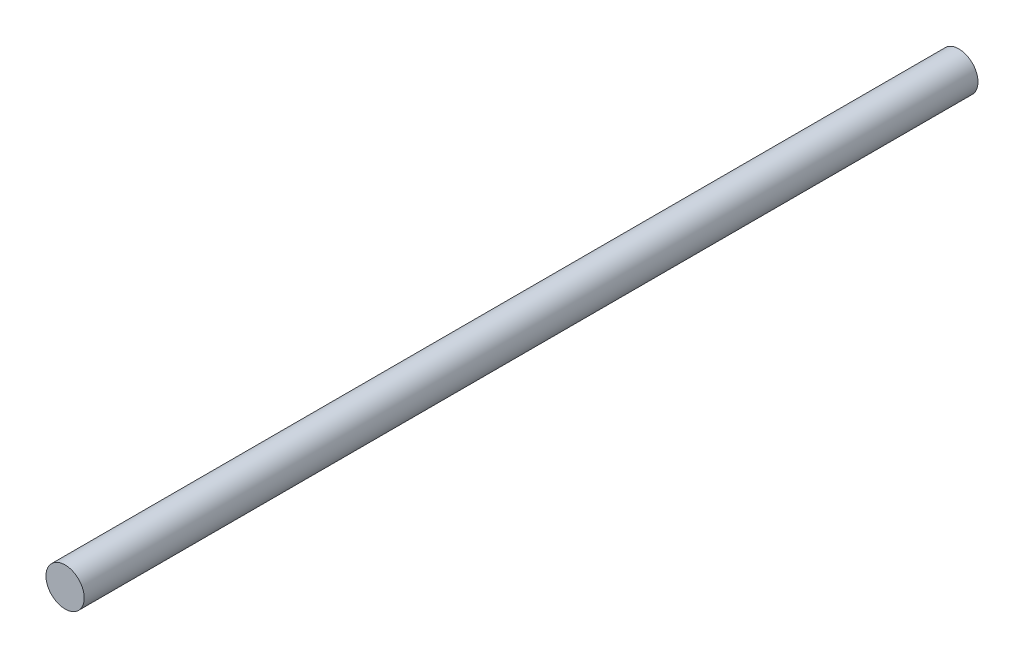
ISO-10303-21;
HEADER;
FILE_DESCRIPTION(('STEP AP214'),'2;1');
FILE_NAME('part.step','',(''),(''),'','','');
FILE_SCHEMA(('AUTOMOTIVE_DESIGN { 1 0 10303 214 1 1 1 1 }'));
ENDSEC;
DATA;
#1=APPLICATION_CONTEXT('core data for automotive mechanical design processes');
#2=APPLICATION_PROTOCOL_DEFINITION('international standard','automotive_design',2000,#1);
#3=PRODUCT_CONTEXT('',#1,'mechanical');
#4=PRODUCT('Part','Part','',(#3));
#5=PRODUCT_RELATED_PRODUCT_CATEGORY('part','',(#4));
#6=PRODUCT_DEFINITION_FORMATION('','',#4);
#7=PRODUCT_DEFINITION_CONTEXT('part definition',#1,'design');
#8=PRODUCT_DEFINITION('design','',#6,#7);
#9=PRODUCT_DEFINITION_SHAPE('','',#8);
#10=(LENGTH_UNIT() NAMED_UNIT(*) SI_UNIT(.MILLI.,.METRE.));
#11=(NAMED_UNIT(*) PLANE_ANGLE_UNIT() SI_UNIT($,.RADIAN.));
#12=(NAMED_UNIT(*) SI_UNIT($,.STERADIAN.) SOLID_ANGLE_UNIT());
#13=UNCERTAINTY_MEASURE_WITH_UNIT(LENGTH_MEASURE(1.E-05),#10,'distance_accuracy_value','');
#14=(GEOMETRIC_REPRESENTATION_CONTEXT(3) GLOBAL_UNCERTAINTY_ASSIGNED_CONTEXT((#13)) GLOBAL_UNIT_ASSIGNED_CONTEXT((#10,
#11,#12)) REPRESENTATION_CONTEXT('',''));
#15=CARTESIAN_POINT('',(0.,0.,0.));
#16=DIRECTION('',(0.,0.,1.));
#17=DIRECTION('',(1.,0.,0.));
#18=AXIS2_PLACEMENT_3D('',#15,#16,#17);
#19=CARTESIAN_POINT('',(0.,0.,500.));
#20=DIRECTION('',(0.,0.,-1.));
#21=DIRECTION('',(-1.,0.,0.));
#22=AXIS2_PLACEMENT_3D('',#19,#20,#21);
#23=CYLINDRICAL_SURFACE('',#22,10.7);
#24=CARTESIAN_POINT('',(0.,0.,500.));
#25=DIRECTION('',(0.,0.,1.));
#26=DIRECTION('',(1.,0.,0.));
#27=AXIS2_PLACEMENT_3D('',#24,#25,#26);
#28=CIRCLE('',#27,10.7);
#29=CARTESIAN_POINT('',(10.7,0.,500.));
#30=VERTEX_POINT('',#29);
#31=EDGE_CURVE('E10',#30,#30,#28,.T.);
#32=ORIENTED_EDGE('',*,*,#31,.F.);
#33=EDGE_LOOP('',(#32));
#34=FACE_BOUND('',#33,.T.);
#35=CARTESIAN_POINT('',(0.,0.,0.));
#36=DIRECTION('',(0.,0.,1.));
#37=DIRECTION('',(1.,0.,0.));
#38=AXIS2_PLACEMENT_3D('',#35,#36,#37);
#39=CIRCLE('',#38,10.7);
#40=CARTESIAN_POINT('',(10.7,0.,0.));
#41=VERTEX_POINT('',#40);
#42=EDGE_CURVE('E40',#41,#41,#39,.T.);
#43=ORIENTED_EDGE('',*,*,#42,.T.);
#44=EDGE_LOOP('',(#43));
#45=FACE_BOUND('',#44,.T.);
#46=ADVANCED_FACE('F37',(#34,#45),#23,.T.);
#47=CARTESIAN_POINT('',(0.,0.,500.));
#48=DIRECTION('',(0.,0.,1.));
#49=DIRECTION('',(1.,0.,0.));
#50=AXIS2_PLACEMENT_3D('',#47,#48,#49);
#51=PLANE('',#50);
#52=ORIENTED_EDGE('',*,*,#31,.T.);
#53=EDGE_LOOP('',(#52));
#54=FACE_BOUND('',#53,.T.);
#55=ADVANCED_FACE('F54',(#54),#51,.T.);
#56=CARTESIAN_POINT('',(0.,0.,0.));
#57=DIRECTION('',(0.,0.,1.));
#58=DIRECTION('',(1.,0.,0.));
#59=AXIS2_PLACEMENT_3D('',#56,#57,#58);
#60=PLANE('',#59);
#61=ORIENTED_EDGE('',*,*,#42,.F.);
#62=EDGE_LOOP('',(#61));
#63=FACE_BOUND('',#62,.T.);
#64=ADVANCED_FACE('F52',(#63),#60,.F.);
#65=CLOSED_SHELL('',(#46,#55,#64));
#66=MANIFOLD_SOLID_BREP('B2',#65);
#67=ADVANCED_BREP_SHAPE_REPRESENTATION('',(#18,#66),#14);
#68=SHAPE_DEFINITION_REPRESENTATION(#9,#67);
ENDSEC;
END-ISO-10303-21;
